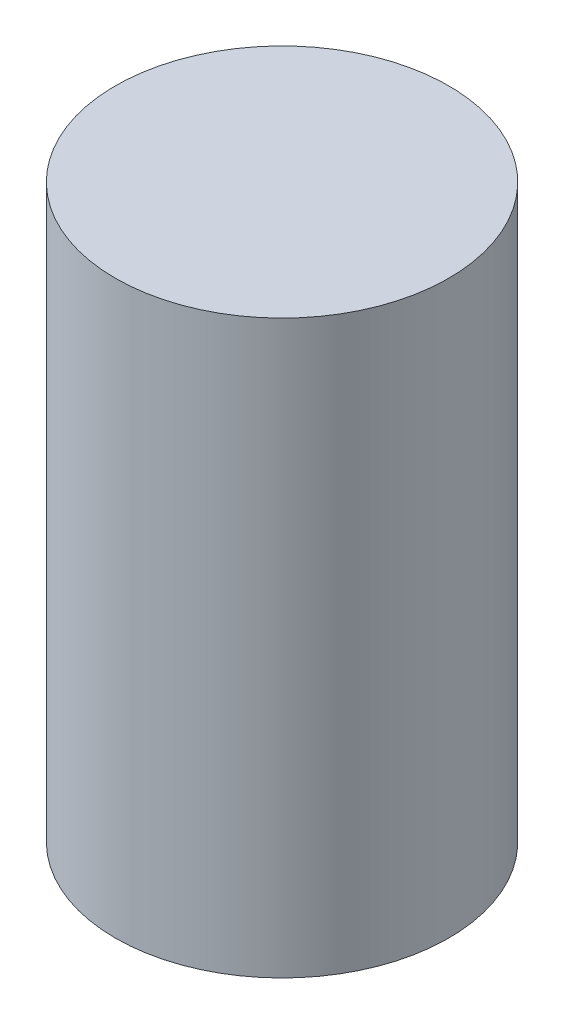
ISO-10303-21;
HEADER;
FILE_DESCRIPTION(('STEP AP214'),'2;1');
FILE_NAME('part.step','',(''),(''),'','','');
FILE_SCHEMA(('AUTOMOTIVE_DESIGN { 1 0 10303 214 1 1 1 1 }'));
ENDSEC;
DATA;
#1=APPLICATION_CONTEXT('core data for automotive mechanical design processes');
#2=APPLICATION_PROTOCOL_DEFINITION('international standard','automotive_design',2000,#1);
#3=PRODUCT_CONTEXT('',#1,'mechanical');
#4=PRODUCT('Part','Part','',(#3));
#5=PRODUCT_RELATED_PRODUCT_CATEGORY('part','',(#4));
#6=PRODUCT_DEFINITION_FORMATION('','',#4);
#7=PRODUCT_DEFINITION_CONTEXT('part definition',#1,'design');
#8=PRODUCT_DEFINITION('design','',#6,#7);
#9=PRODUCT_DEFINITION_SHAPE('','',#8);
#10=(LENGTH_UNIT() NAMED_UNIT(*) SI_UNIT(.MILLI.,.METRE.));
#11=(NAMED_UNIT(*) PLANE_ANGLE_UNIT() SI_UNIT($,.RADIAN.));
#12=(NAMED_UNIT(*) SI_UNIT($,.STERADIAN.) SOLID_ANGLE_UNIT());
#13=UNCERTAINTY_MEASURE_WITH_UNIT(LENGTH_MEASURE(1.E-05),#10,'distance_accuracy_value','');
#14=(GEOMETRIC_REPRESENTATION_CONTEXT(3) GLOBAL_UNCERTAINTY_ASSIGNED_CONTEXT((#13)) GLOBAL_UNIT_ASSIGNED_CONTEXT((#10,
#11,#12)) REPRESENTATION_CONTEXT('',''));
#15=CARTESIAN_POINT('',(0.,0.,0.));
#16=DIRECTION('',(0.,0.,1.));
#17=DIRECTION('',(1.,0.,0.));
#18=AXIS2_PLACEMENT_3D('',#15,#16,#17);
#19=CARTESIAN_POINT('',(0.,-1.5,0.));
#20=DIRECTION('',(0.,-1.,0.));
#21=DIRECTION('',(0.,0.,-1.));
#22=AXIS2_PLACEMENT_3D('',#19,#20,#21);
#23=PLANE('',#22);
#24=CARTESIAN_POINT('',(0.,-1.5,0.));
#25=DIRECTION('',(0.,1.,0.));
#26=DIRECTION('',(0.,0.,1.));
#27=AXIS2_PLACEMENT_3D('',#24,#25,#26);
#28=CIRCLE('',#27,2.5);
#29=CARTESIAN_POINT('',(0.,-1.5,2.5));
#30=VERTEX_POINT('',#29);
#31=EDGE_CURVE('E10',#30,#30,#28,.T.);
#32=ORIENTED_EDGE('',*,*,#31,.F.);
#33=EDGE_LOOP('',(#32));
#34=FACE_BOUND('',#33,.T.);
#35=ADVANCED_FACE('F32',(#34),#23,.T.);
#36=CARTESIAN_POINT('',(0.,0.,0.));
#37=DIRECTION('',(0.,1.,0.));
#38=DIRECTION('',(0.,0.,1.));
#39=AXIS2_PLACEMENT_3D('',#36,#37,#38);
#40=CYLINDRICAL_SURFACE('',#39,2.5);
#41=ORIENTED_EDGE('',*,*,#31,.T.);
#42=EDGE_LOOP('',(#41));
#43=FACE_BOUND('',#42,.T.);
#44=CARTESIAN_POINT('',(0.,0.,0.));
#45=DIRECTION('',(0.,1.,0.));
#46=DIRECTION('',(0.,0.,1.));
#47=AXIS2_PLACEMENT_3D('',#44,#45,#46);
#48=CIRCLE('',#47,2.5);
#49=CARTESIAN_POINT('',(0.,0.,2.5));
#50=VERTEX_POINT('',#49);
#51=EDGE_CURVE('E39',#50,#50,#48,.T.);
#52=ORIENTED_EDGE('',*,*,#51,.F.);
#53=EDGE_LOOP('',(#52));
#54=FACE_BOUND('',#53,.T.);
#55=ADVANCED_FACE('F68',(#43,#54),#40,.T.);
#56=CARTESIAN_POINT('',(-2.5,0.,0.));
#57=DIRECTION('',(0.,-1.,0.));
#58=DIRECTION('',(0.,0.,-1.));
#59=AXIS2_PLACEMENT_3D('',#56,#57,#58);
#60=PLANE('',#59);
#61=ORIENTED_EDGE('',*,*,#51,.T.);
#62=EDGE_LOOP('',(#61));
#63=FACE_BOUND('',#62,.T.);
#64=CARTESIAN_POINT('',(0.,0.,0.));
#65=DIRECTION('',(0.,1.,0.));
#66=DIRECTION('',(0.,0.,1.));
#67=AXIS2_PLACEMENT_3D('',#64,#65,#66);
#68=CIRCLE('',#67,6.3);
#69=CARTESIAN_POINT('',(0.,0.,6.3));
#70=VERTEX_POINT('',#69);
#71=EDGE_CURVE('E45',#70,#70,#68,.T.);
#72=ORIENTED_EDGE('',*,*,#71,.F.);
#73=EDGE_LOOP('',(#72));
#74=FACE_BOUND('',#73,.T.);
#75=ADVANCED_FACE('F60',(#63,#74),#60,.T.);
#76=CARTESIAN_POINT('',(0.,0.,0.));
#77=DIRECTION('',(0.,1.,0.));
#78=DIRECTION('',(0.,0.,1.));
#79=AXIS2_PLACEMENT_3D('',#76,#77,#78);
#80=CYLINDRICAL_SURFACE('',#79,6.3);
#81=ORIENTED_EDGE('',*,*,#71,.T.);
#82=EDGE_LOOP('',(#81));
#83=FACE_BOUND('',#82,.T.);
#84=CARTESIAN_POINT('',(0.,21.6,0.));
#85=DIRECTION('',(0.,1.,0.));
#86=DIRECTION('',(0.,0.,1.));
#87=AXIS2_PLACEMENT_3D('',#84,#85,#86);
#88=CIRCLE('',#87,6.3);
#89=CARTESIAN_POINT('',(0.,21.6,6.3));
#90=VERTEX_POINT('',#89);
#91=EDGE_CURVE('E49',#90,#90,#88,.T.);
#92=ORIENTED_EDGE('',*,*,#91,.F.);
#93=EDGE_LOOP('',(#92));
#94=FACE_BOUND('',#93,.T.);
#95=ADVANCED_FACE('F58',(#83,#94),#80,.T.);
#96=CARTESIAN_POINT('',(0.,21.6,0.));
#97=DIRECTION('',(0.,1.,0.));
#98=DIRECTION('',(0.,0.,1.));
#99=AXIS2_PLACEMENT_3D('',#96,#97,#98);
#100=PLANE('',#99);
#101=ORIENTED_EDGE('',*,*,#91,.T.);
#102=EDGE_LOOP('',(#101));
#103=FACE_BOUND('',#102,.T.);
#104=ADVANCED_FACE('F56',(#103),#100,.T.);
#105=CLOSED_SHELL('',(#35,#55,#75,#95,#104));
#106=MANIFOLD_SOLID_BREP('B2',#105);
#107=ADVANCED_BREP_SHAPE_REPRESENTATION('',(#18,#106),#14);
#108=SHAPE_DEFINITION_REPRESENTATION(#9,#107);
ENDSEC;
END-ISO-10303-21;
